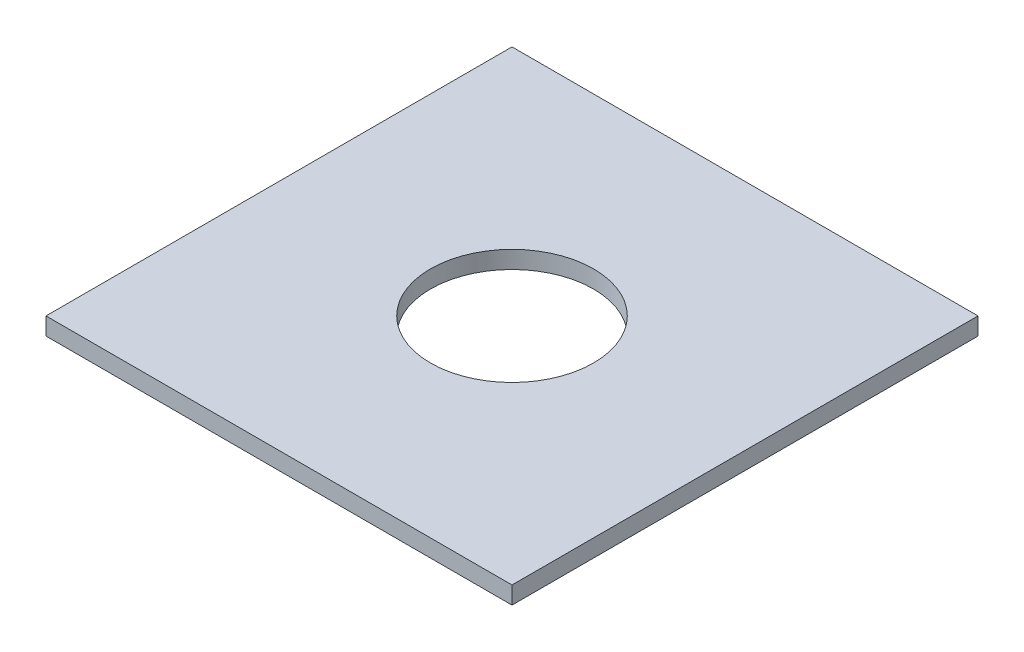
ISO-10303-21;
HEADER;
FILE_DESCRIPTION(('STEP AP214'),'2;1');
FILE_NAME('part.step','',(''),(''),'','','');
FILE_SCHEMA(('AUTOMOTIVE_DESIGN { 1 0 10303 214 1 1 1 1 }'));
ENDSEC;
DATA;
#1=APPLICATION_CONTEXT('core data for automotive mechanical design processes');
#2=APPLICATION_PROTOCOL_DEFINITION('international standard','automotive_design',2000,#1);
#3=PRODUCT_CONTEXT('',#1,'mechanical');
#4=PRODUCT('Part','Part','',(#3));
#5=PRODUCT_RELATED_PRODUCT_CATEGORY('part','',(#4));
#6=PRODUCT_DEFINITION_FORMATION('','',#4);
#7=PRODUCT_DEFINITION_CONTEXT('part definition',#1,'design');
#8=PRODUCT_DEFINITION('design','',#6,#7);
#9=PRODUCT_DEFINITION_SHAPE('','',#8);
#10=(LENGTH_UNIT() NAMED_UNIT(*) SI_UNIT(.MILLI.,.METRE.));
#11=(NAMED_UNIT(*) PLANE_ANGLE_UNIT() SI_UNIT($,.RADIAN.));
#12=(NAMED_UNIT(*) SI_UNIT($,.STERADIAN.) SOLID_ANGLE_UNIT());
#13=UNCERTAINTY_MEASURE_WITH_UNIT(LENGTH_MEASURE(1.E-05),#10,'distance_accuracy_value','');
#14=(GEOMETRIC_REPRESENTATION_CONTEXT(3) GLOBAL_UNCERTAINTY_ASSIGNED_CONTEXT((#13)) GLOBAL_UNIT_ASSIGNED_CONTEXT((#10,
#11,#12)) REPRESENTATION_CONTEXT('',''));
#15=CARTESIAN_POINT('',(0.,0.,0.));
#16=DIRECTION('',(0.,0.,1.));
#17=DIRECTION('',(1.,0.,0.));
#18=AXIS2_PLACEMENT_3D('',#15,#16,#17);
#19=CARTESIAN_POINT('',(0.,3.,0.));
#20=DIRECTION('',(0.,-1.,0.));
#21=DIRECTION('',(0.,0.,-1.));
#22=AXIS2_PLACEMENT_3D('',#19,#20,#21);
#23=PLANE('',#22);
#24=DIRECTION('',(0.,0.,-1.));
#25=VECTOR('',#24,1.);
#26=CARTESIAN_POINT('',(40.,3.,40.));
#27=LINE('',#26,#25);
#28=CARTESIAN_POINT('',(40.,3.,40.));
#29=VERTEX_POINT('',#28);
#30=CARTESIAN_POINT('',(40.,3.,-40.));
#31=VERTEX_POINT('',#30);
#32=EDGE_CURVE('E94',#29,#31,#27,.T.);
#33=ORIENTED_EDGE('',*,*,#32,.T.);
#34=DIRECTION('',(-1.,0.,0.));
#35=VECTOR('',#34,1.);
#36=CARTESIAN_POINT('',(-40.,3.,-40.));
#37=LINE('',#36,#35);
#38=CARTESIAN_POINT('',(-40.,3.,-40.));
#39=VERTEX_POINT('',#38);
#40=EDGE_CURVE('E89',#31,#39,#37,.T.);
#41=ORIENTED_EDGE('',*,*,#40,.T.);
#42=DIRECTION('',(0.,0.,1.));
#43=VECTOR('',#42,1.);
#44=CARTESIAN_POINT('',(-40.,3.,40.));
#45=LINE('',#44,#43);
#46=CARTESIAN_POINT('',(-40.,3.,40.));
#47=VERTEX_POINT('',#46);
#48=EDGE_CURVE('E92',#39,#47,#45,.T.);
#49=ORIENTED_EDGE('',*,*,#48,.T.);
#50=DIRECTION('',(1.,0.,0.));
#51=VECTOR('',#50,1.);
#52=CARTESIAN_POINT('',(-40.,3.,40.));
#53=LINE('',#52,#51);
#54=EDGE_CURVE('E59',#47,#29,#53,.T.);
#55=ORIENTED_EDGE('',*,*,#54,.T.);
#56=EDGE_LOOP('',(#33,#41,#49,#55));
#57=FACE_BOUND('',#56,.T.);
#58=CARTESIAN_POINT('',(0.,3.,0.));
#59=DIRECTION('',(0.,1.,0.));
#60=DIRECTION('',(0.,0.,1.));
#61=AXIS2_PLACEMENT_3D('',#58,#59,#60);
#62=CIRCLE('',#61,14.);
#63=CARTESIAN_POINT('',(0.,3.,14.));
#64=VERTEX_POINT('',#63);
#65=EDGE_CURVE('E109',#64,#64,#62,.T.);
#66=ORIENTED_EDGE('',*,*,#65,.F.);
#67=EDGE_LOOP('',(#66));
#68=FACE_BOUND('',#67,.T.);
#69=ADVANCED_FACE('F42',(#57,#68),#23,.F.);
#70=CARTESIAN_POINT('',(0.,0.,0.));
#71=DIRECTION('',(0.,-1.,0.));
#72=DIRECTION('',(0.,0.,-1.));
#73=AXIS2_PLACEMENT_3D('',#70,#71,#72);
#74=PLANE('',#73);
#75=DIRECTION('',(0.,0.,-1.));
#76=VECTOR('',#75,1.);
#77=CARTESIAN_POINT('',(40.,0.,40.));
#78=LINE('',#77,#76);
#79=CARTESIAN_POINT('',(40.,0.,40.));
#80=VERTEX_POINT('',#79);
#81=CARTESIAN_POINT('',(40.,0.,-40.));
#82=VERTEX_POINT('',#81);
#83=EDGE_CURVE('E106',#80,#82,#78,.T.);
#84=ORIENTED_EDGE('',*,*,#83,.F.);
#85=DIRECTION('',(1.,0.,0.));
#86=VECTOR('',#85,1.);
#87=CARTESIAN_POINT('',(-40.,0.,40.));
#88=LINE('',#87,#86);
#89=CARTESIAN_POINT('',(-40.,0.,40.));
#90=VERTEX_POINT('',#89);
#91=EDGE_CURVE('E82',#90,#80,#88,.T.);
#92=ORIENTED_EDGE('',*,*,#91,.F.);
#93=DIRECTION('',(0.,0.,1.));
#94=VECTOR('',#93,1.);
#95=CARTESIAN_POINT('',(-40.,0.,40.));
#96=LINE('',#95,#94);
#97=CARTESIAN_POINT('',(-40.,0.,-40.));
#98=VERTEX_POINT('',#97);
#99=EDGE_CURVE('E76',#98,#90,#96,.T.);
#100=ORIENTED_EDGE('',*,*,#99,.F.);
#101=DIRECTION('',(-1.,0.,0.));
#102=VECTOR('',#101,1.);
#103=CARTESIAN_POINT('',(-40.,0.,-40.));
#104=LINE('',#103,#102);
#105=EDGE_CURVE('E98',#82,#98,#104,.T.);
#106=ORIENTED_EDGE('',*,*,#105,.F.);
#107=EDGE_LOOP('',(#84,#92,#100,#106));
#108=FACE_BOUND('',#107,.T.);
#109=CARTESIAN_POINT('',(0.,0.,0.));
#110=DIRECTION('',(0.,1.,0.));
#111=DIRECTION('',(0.,0.,1.));
#112=AXIS2_PLACEMENT_3D('',#109,#110,#111);
#113=CIRCLE('',#112,14.);
#114=CARTESIAN_POINT('',(0.,0.,14.));
#115=VERTEX_POINT('',#114);
#116=EDGE_CURVE('E121',#115,#115,#113,.T.);
#117=ORIENTED_EDGE('',*,*,#116,.T.);
#118=EDGE_LOOP('',(#117));
#119=FACE_BOUND('',#118,.T.);
#120=ADVANCED_FACE('F117',(#108,#119),#74,.T.);
#121=CARTESIAN_POINT('',(40.,3.,40.));
#122=DIRECTION('',(-1.,0.,0.));
#123=DIRECTION('',(0.,0.,1.));
#124=AXIS2_PLACEMENT_3D('',#121,#122,#123);
#125=PLANE('',#124);
#126=ORIENTED_EDGE('',*,*,#83,.T.);
#127=DIRECTION('',(0.,-1.,0.));
#128=VECTOR('',#127,1.);
#129=CARTESIAN_POINT('',(40.,3.,-40.));
#130=LINE('',#129,#128);
#131=EDGE_CURVE('E11',#31,#82,#130,.T.);
#132=ORIENTED_EDGE('',*,*,#131,.F.);
#133=ORIENTED_EDGE('',*,*,#32,.F.);
#134=DIRECTION('',(0.,-1.,0.));
#135=VECTOR('',#134,1.);
#136=CARTESIAN_POINT('',(40.,3.,40.));
#137=LINE('',#136,#135);
#138=EDGE_CURVE('E102',#29,#80,#137,.T.);
#139=ORIENTED_EDGE('',*,*,#138,.T.);
#140=EDGE_LOOP('',(#126,#132,#133,#139));
#141=FACE_BOUND('',#140,.T.);
#142=ADVANCED_FACE('F44',(#141),#125,.F.);
#143=CARTESIAN_POINT('',(-40.,3.,-40.));
#144=DIRECTION('',(0.,0.,1.));
#145=DIRECTION('',(1.,0.,0.));
#146=AXIS2_PLACEMENT_3D('',#143,#144,#145);
#147=PLANE('',#146);
#148=ORIENTED_EDGE('',*,*,#105,.T.);
#149=DIRECTION('',(0.,-1.,0.));
#150=VECTOR('',#149,1.);
#151=CARTESIAN_POINT('',(-40.,3.,-40.));
#152=LINE('',#151,#150);
#153=EDGE_CURVE('E51',#39,#98,#152,.T.);
#154=ORIENTED_EDGE('',*,*,#153,.F.);
#155=ORIENTED_EDGE('',*,*,#40,.F.);
#156=ORIENTED_EDGE('',*,*,#131,.T.);
#157=EDGE_LOOP('',(#148,#154,#155,#156));
#158=FACE_BOUND('',#157,.T.);
#159=ADVANCED_FACE('F97',(#158),#147,.F.);
#160=CARTESIAN_POINT('',(-40.,3.,40.));
#161=DIRECTION('',(1.,0.,0.));
#162=DIRECTION('',(0.,0.,-1.));
#163=AXIS2_PLACEMENT_3D('',#160,#161,#162);
#164=PLANE('',#163);
#165=ORIENTED_EDGE('',*,*,#99,.T.);
#166=DIRECTION('',(0.,-1.,0.));
#167=VECTOR('',#166,1.);
#168=CARTESIAN_POINT('',(-40.,3.,40.));
#169=LINE('',#168,#167);
#170=EDGE_CURVE('E99',#47,#90,#169,.T.);
#171=ORIENTED_EDGE('',*,*,#170,.F.);
#172=ORIENTED_EDGE('',*,*,#48,.F.);
#173=ORIENTED_EDGE('',*,*,#153,.T.);
#174=EDGE_LOOP('',(#165,#171,#172,#173));
#175=FACE_BOUND('',#174,.T.);
#176=ADVANCED_FACE('F100',(#175),#164,.F.);
#177=CARTESIAN_POINT('',(-40.,3.,40.));
#178=DIRECTION('',(0.,0.,-1.));
#179=DIRECTION('',(-1.,0.,0.));
#180=AXIS2_PLACEMENT_3D('',#177,#178,#179);
#181=PLANE('',#180);
#182=ORIENTED_EDGE('',*,*,#91,.T.);
#183=ORIENTED_EDGE('',*,*,#138,.F.);
#184=ORIENTED_EDGE('',*,*,#54,.F.);
#185=ORIENTED_EDGE('',*,*,#170,.T.);
#186=EDGE_LOOP('',(#182,#183,#184,#185));
#187=FACE_BOUND('',#186,.T.);
#188=ADVANCED_FACE('F114',(#187),#181,.F.);
#189=CARTESIAN_POINT('',(0.,3.,0.));
#190=DIRECTION('',(0.,-1.,0.));
#191=DIRECTION('',(0.,0.,-1.));
#192=AXIS2_PLACEMENT_3D('',#189,#190,#191);
#193=CYLINDRICAL_SURFACE('',#192,14.);
#194=ORIENTED_EDGE('',*,*,#65,.T.);
#195=EDGE_LOOP('',(#194));
#196=FACE_BOUND('',#195,.T.);
#197=ORIENTED_EDGE('',*,*,#116,.F.);
#198=EDGE_LOOP('',(#197));
#199=FACE_BOUND('',#198,.T.);
#200=ADVANCED_FACE('F127',(#196,#199),#193,.F.);
#201=CLOSED_SHELL('',(#69,#120,#142,#159,#176,#188,#200));
#202=MANIFOLD_SOLID_BREP('B2',#201);
#203=ADVANCED_BREP_SHAPE_REPRESENTATION('',(#18,#202),#14);
#204=SHAPE_DEFINITION_REPRESENTATION(#9,#203);
ENDSEC;
END-ISO-10303-21;
